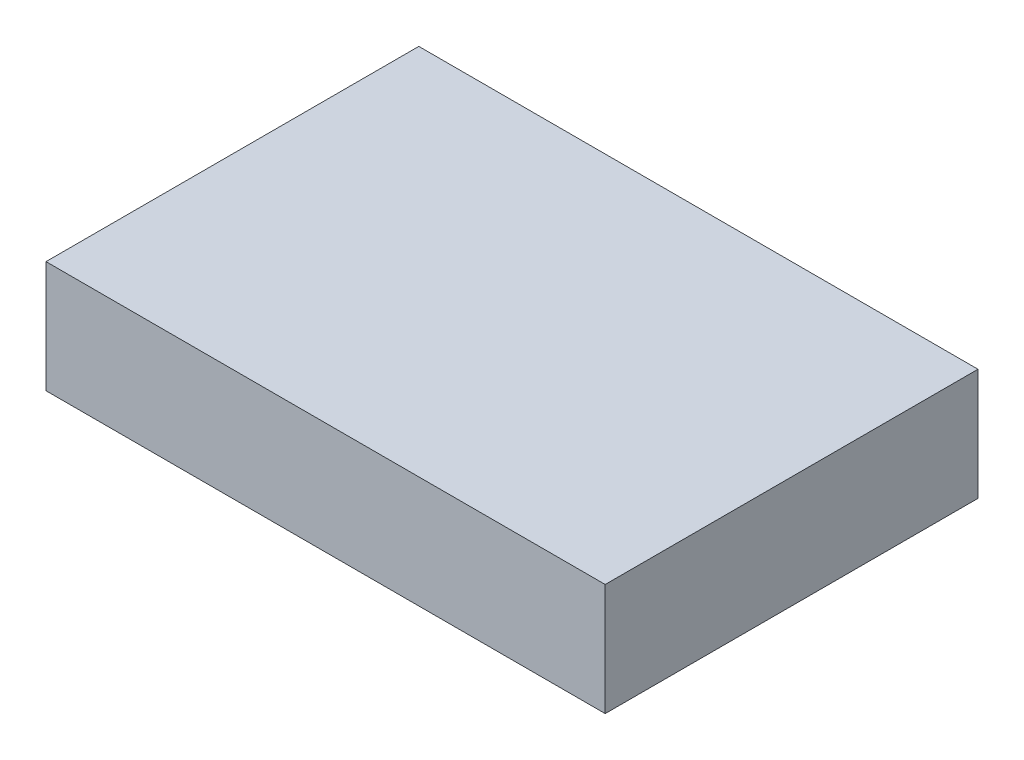
ISO-10303-21;
HEADER;
FILE_DESCRIPTION(('STEP AP214'),'2;1');
FILE_NAME('part.step','',(''),(''),'','','');
FILE_SCHEMA(('AUTOMOTIVE_DESIGN { 1 0 10303 214 1 1 1 1 }'));
ENDSEC;
DATA;
#1=APPLICATION_CONTEXT('core data for automotive mechanical design processes');
#2=APPLICATION_PROTOCOL_DEFINITION('international standard','automotive_design',2000,#1);
#3=PRODUCT_CONTEXT('',#1,'mechanical');
#4=PRODUCT('Part','Part','',(#3));
#5=PRODUCT_RELATED_PRODUCT_CATEGORY('part','',(#4));
#6=PRODUCT_DEFINITION_FORMATION('','',#4);
#7=PRODUCT_DEFINITION_CONTEXT('part definition',#1,'design');
#8=PRODUCT_DEFINITION('design','',#6,#7);
#9=PRODUCT_DEFINITION_SHAPE('','',#8);
#10=(LENGTH_UNIT() NAMED_UNIT(*) SI_UNIT(.MILLI.,.METRE.));
#11=(NAMED_UNIT(*) PLANE_ANGLE_UNIT() SI_UNIT($,.RADIAN.));
#12=(NAMED_UNIT(*) SI_UNIT($,.STERADIAN.) SOLID_ANGLE_UNIT());
#13=UNCERTAINTY_MEASURE_WITH_UNIT(LENGTH_MEASURE(1.E-05),#10,'distance_accuracy_value','');
#14=(GEOMETRIC_REPRESENTATION_CONTEXT(3) GLOBAL_UNCERTAINTY_ASSIGNED_CONTEXT((#13)) GLOBAL_UNIT_ASSIGNED_CONTEXT((#10,
#11,#12)) REPRESENTATION_CONTEXT('',''));
#15=CARTESIAN_POINT('',(0.,0.,0.));
#16=DIRECTION('',(0.,0.,1.));
#17=DIRECTION('',(1.,0.,0.));
#18=AXIS2_PLACEMENT_3D('',#15,#16,#17);
#19=CARTESIAN_POINT('',(30.,12.,20.));
#20=DIRECTION('',(-1.,0.,0.));
#21=DIRECTION('',(0.,0.,1.));
#22=AXIS2_PLACEMENT_3D('',#19,#20,#21);
#23=PLANE('',#22);
#24=DIRECTION('',(0.,0.,-1.));
#25=VECTOR('',#24,1.);
#26=CARTESIAN_POINT('',(30.,0.,20.));
#27=LINE('',#26,#25);
#28=CARTESIAN_POINT('',(30.,0.,20.));
#29=VERTEX_POINT('',#28);
#30=CARTESIAN_POINT('',(30.,0.,-20.));
#31=VERTEX_POINT('',#30);
#32=EDGE_CURVE('E96',#29,#31,#27,.T.);
#33=ORIENTED_EDGE('',*,*,#32,.T.);
#34=DIRECTION('',(0.,-1.,0.));
#35=VECTOR('',#34,1.);
#36=CARTESIAN_POINT('',(30.,12.,-20.));
#37=LINE('',#36,#35);
#38=CARTESIAN_POINT('',(30.,12.,-20.));
#39=VERTEX_POINT('',#38);
#40=EDGE_CURVE('E11',#39,#31,#37,.T.);
#41=ORIENTED_EDGE('',*,*,#40,.F.);
#42=DIRECTION('',(0.,0.,-1.));
#43=VECTOR('',#42,1.);
#44=CARTESIAN_POINT('',(30.,12.,20.));
#45=LINE('',#44,#43);
#46=CARTESIAN_POINT('',(30.,12.,20.));
#47=VERTEX_POINT('',#46);
#48=EDGE_CURVE('E84',#47,#39,#45,.T.);
#49=ORIENTED_EDGE('',*,*,#48,.F.);
#50=DIRECTION('',(0.,-1.,0.));
#51=VECTOR('',#50,1.);
#52=CARTESIAN_POINT('',(30.,12.,20.));
#53=LINE('',#52,#51);
#54=EDGE_CURVE('E92',#47,#29,#53,.T.);
#55=ORIENTED_EDGE('',*,*,#54,.T.);
#56=EDGE_LOOP('',(#33,#41,#49,#55));
#57=FACE_BOUND('',#56,.T.);
#58=ADVANCED_FACE('F33',(#57),#23,.F.);
#59=CARTESIAN_POINT('',(-30.,12.,-20.));
#60=DIRECTION('',(0.,0.,1.));
#61=DIRECTION('',(1.,0.,0.));
#62=AXIS2_PLACEMENT_3D('',#59,#60,#61);
#63=PLANE('',#62);
#64=DIRECTION('',(-1.,0.,0.));
#65=VECTOR('',#64,1.);
#66=CARTESIAN_POINT('',(-30.,0.,-20.));
#67=LINE('',#66,#65);
#68=CARTESIAN_POINT('',(-30.,0.,-20.));
#69=VERTEX_POINT('',#68);
#70=EDGE_CURVE('E88',#31,#69,#67,.T.);
#71=ORIENTED_EDGE('',*,*,#70,.T.);
#72=DIRECTION('',(0.,-1.,0.));
#73=VECTOR('',#72,1.);
#74=CARTESIAN_POINT('',(-30.,12.,-20.));
#75=LINE('',#74,#73);
#76=CARTESIAN_POINT('',(-30.,12.,-20.));
#77=VERTEX_POINT('',#76);
#78=EDGE_CURVE('E41',#77,#69,#75,.T.);
#79=ORIENTED_EDGE('',*,*,#78,.F.);
#80=DIRECTION('',(-1.,0.,0.));
#81=VECTOR('',#80,1.);
#82=CARTESIAN_POINT('',(-30.,12.,-20.));
#83=LINE('',#82,#81);
#84=EDGE_CURVE('E79',#39,#77,#83,.T.);
#85=ORIENTED_EDGE('',*,*,#84,.F.);
#86=ORIENTED_EDGE('',*,*,#40,.T.);
#87=EDGE_LOOP('',(#71,#79,#85,#86));
#88=FACE_BOUND('',#87,.T.);
#89=ADVANCED_FACE('F87',(#88),#63,.F.);
#90=CARTESIAN_POINT('',(-30.,12.,20.));
#91=DIRECTION('',(1.,0.,0.));
#92=DIRECTION('',(0.,0.,-1.));
#93=AXIS2_PLACEMENT_3D('',#90,#91,#92);
#94=PLANE('',#93);
#95=DIRECTION('',(0.,0.,1.));
#96=VECTOR('',#95,1.);
#97=CARTESIAN_POINT('',(-30.,0.,20.));
#98=LINE('',#97,#96);
#99=CARTESIAN_POINT('',(-30.,0.,20.));
#100=VERTEX_POINT('',#99);
#101=EDGE_CURVE('E66',#69,#100,#98,.T.);
#102=ORIENTED_EDGE('',*,*,#101,.T.);
#103=DIRECTION('',(0.,-1.,0.));
#104=VECTOR('',#103,1.);
#105=CARTESIAN_POINT('',(-30.,12.,20.));
#106=LINE('',#105,#104);
#107=CARTESIAN_POINT('',(-30.,12.,20.));
#108=VERTEX_POINT('',#107);
#109=EDGE_CURVE('E89',#108,#100,#106,.T.);
#110=ORIENTED_EDGE('',*,*,#109,.F.);
#111=DIRECTION('',(0.,0.,1.));
#112=VECTOR('',#111,1.);
#113=CARTESIAN_POINT('',(-30.,12.,20.));
#114=LINE('',#113,#112);
#115=EDGE_CURVE('E82',#77,#108,#114,.T.);
#116=ORIENTED_EDGE('',*,*,#115,.F.);
#117=ORIENTED_EDGE('',*,*,#78,.T.);
#118=EDGE_LOOP('',(#102,#110,#116,#117));
#119=FACE_BOUND('',#118,.T.);
#120=ADVANCED_FACE('F90',(#119),#94,.F.);
#121=CARTESIAN_POINT('',(-30.,12.,20.));
#122=DIRECTION('',(0.,0.,-1.));
#123=DIRECTION('',(-1.,0.,0.));
#124=AXIS2_PLACEMENT_3D('',#121,#122,#123);
#125=PLANE('',#124);
#126=DIRECTION('',(1.,0.,0.));
#127=VECTOR('',#126,1.);
#128=CARTESIAN_POINT('',(-30.,0.,20.));
#129=LINE('',#128,#127);
#130=EDGE_CURVE('E72',#100,#29,#129,.T.);
#131=ORIENTED_EDGE('',*,*,#130,.T.);
#132=ORIENTED_EDGE('',*,*,#54,.F.);
#133=DIRECTION('',(1.,0.,0.));
#134=VECTOR('',#133,1.);
#135=CARTESIAN_POINT('',(-30.,12.,20.));
#136=LINE('',#135,#134);
#137=EDGE_CURVE('E49',#108,#47,#136,.T.);
#138=ORIENTED_EDGE('',*,*,#137,.F.);
#139=ORIENTED_EDGE('',*,*,#109,.T.);
#140=EDGE_LOOP('',(#131,#132,#138,#139));
#141=FACE_BOUND('',#140,.T.);
#142=ADVANCED_FACE('F103',(#141),#125,.F.);
#143=CARTESIAN_POINT('',(0.,12.,0.));
#144=DIRECTION('',(0.,-1.,0.));
#145=DIRECTION('',(0.,0.,-1.));
#146=AXIS2_PLACEMENT_3D('',#143,#144,#145);
#147=PLANE('',#146);
#148=ORIENTED_EDGE('',*,*,#48,.T.);
#149=ORIENTED_EDGE('',*,*,#84,.T.);
#150=ORIENTED_EDGE('',*,*,#115,.T.);
#151=ORIENTED_EDGE('',*,*,#137,.T.);
#152=EDGE_LOOP('',(#148,#149,#150,#151));
#153=FACE_BOUND('',#152,.T.);
#154=ADVANCED_FACE('F80',(#153),#147,.F.);
#155=CARTESIAN_POINT('',(0.,0.,0.));
#156=DIRECTION('',(0.,-1.,0.));
#157=DIRECTION('',(0.,0.,-1.));
#158=AXIS2_PLACEMENT_3D('',#155,#156,#157);
#159=PLANE('',#158);
#160=ORIENTED_EDGE('',*,*,#32,.F.);
#161=ORIENTED_EDGE('',*,*,#130,.F.);
#162=ORIENTED_EDGE('',*,*,#101,.F.);
#163=ORIENTED_EDGE('',*,*,#70,.F.);
#164=EDGE_LOOP('',(#160,#161,#162,#163));
#165=FACE_BOUND('',#164,.T.);
#166=ADVANCED_FACE('F106',(#165),#159,.T.);
#167=CLOSED_SHELL('',(#58,#89,#120,#142,#154,#166));
#168=MANIFOLD_SOLID_BREP('B2',#167);
#169=ADVANCED_BREP_SHAPE_REPRESENTATION('',(#18,#168),#14);
#170=SHAPE_DEFINITION_REPRESENTATION(#9,#169);
ENDSEC;
END-ISO-10303-21;
